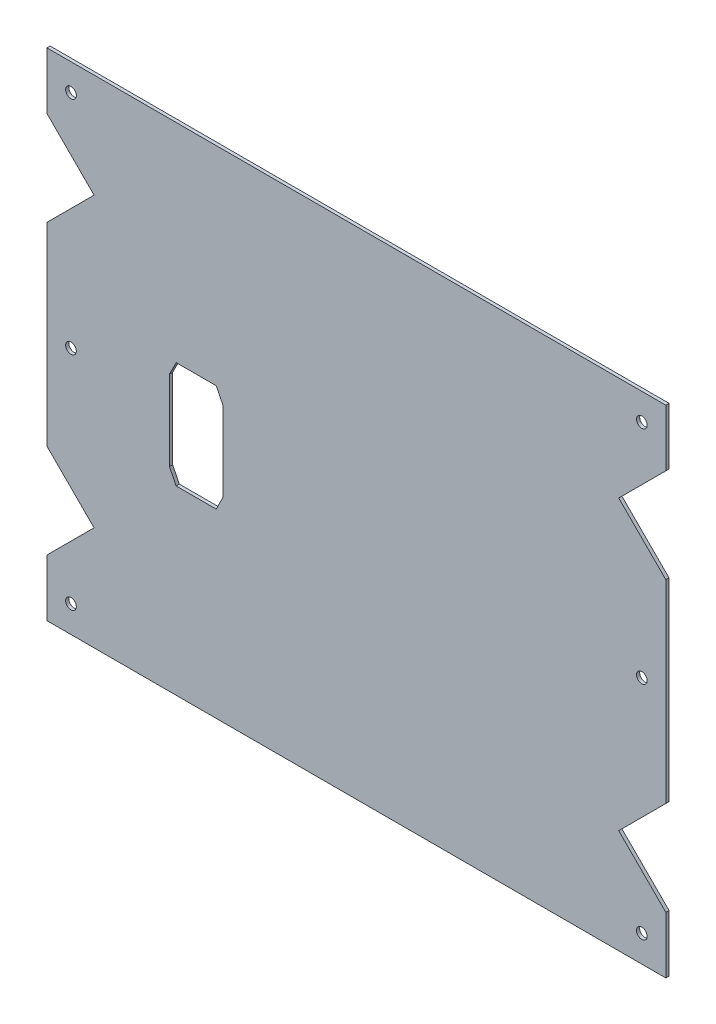
ISO-10303-21;
HEADER;
FILE_DESCRIPTION(('STEP AP214'),'2;1');
FILE_NAME('part.step','',(''),(''),'','','');
FILE_SCHEMA(('AUTOMOTIVE_DESIGN { 1 0 10303 214 1 1 1 1 }'));
ENDSEC;
DATA;
#1=APPLICATION_CONTEXT('core data for automotive mechanical design processes');
#2=APPLICATION_PROTOCOL_DEFINITION('international standard','automotive_design',2000,#1);
#3=PRODUCT_CONTEXT('',#1,'mechanical');
#4=PRODUCT('Part','Part','',(#3));
#5=PRODUCT_RELATED_PRODUCT_CATEGORY('part','',(#4));
#6=PRODUCT_DEFINITION_FORMATION('','',#4);
#7=PRODUCT_DEFINITION_CONTEXT('part definition',#1,'design');
#8=PRODUCT_DEFINITION('design','',#6,#7);
#9=PRODUCT_DEFINITION_SHAPE('','',#8);
#10=(LENGTH_UNIT() NAMED_UNIT(*) SI_UNIT(.MILLI.,.METRE.));
#11=(NAMED_UNIT(*) PLANE_ANGLE_UNIT() SI_UNIT($,.RADIAN.));
#12=(NAMED_UNIT(*) SI_UNIT($,.STERADIAN.) SOLID_ANGLE_UNIT());
#13=UNCERTAINTY_MEASURE_WITH_UNIT(LENGTH_MEASURE(1.E-05),#10,'distance_accuracy_value','');
#14=(GEOMETRIC_REPRESENTATION_CONTEXT(3) GLOBAL_UNCERTAINTY_ASSIGNED_CONTEXT((#13)) GLOBAL_UNIT_ASSIGNED_CONTEXT((#10,
#11,#12)) REPRESENTATION_CONTEXT('',''));
#15=CARTESIAN_POINT('',(0.,0.,0.));
#16=DIRECTION('',(0.,0.,1.));
#17=DIRECTION('',(1.,0.,0.));
#18=AXIS2_PLACEMENT_3D('',#15,#16,#17);
#19=CARTESIAN_POINT('',(0.,0.,-1.2));
#20=DIRECTION('',(0.,0.,-1.));
#21=DIRECTION('',(-1.,0.,0.));
#22=AXIS2_PLACEMENT_3D('',#19,#20,#21);
#23=PLANE('',#22);
#24=DIRECTION('',(0.707106781186547,0.707106781186548,0.));
#25=VECTOR('',#24,1.);
#26=CARTESIAN_POINT('',(-52.5334809732131,54.6464466094065,-1.19999999999963));
#27=LINE('',#26,#25);
#28=CARTESIAN_POINT('',(-15.8870343638064,91.2928932188133,-1.19999999999988));
#29=VERTEX_POINT('',#28);
#30=CARTESIAN_POINT('',(1.76358959928331,108.943517181903,-1.2));
#31=VERTEX_POINT('',#30);
#32=EDGE_CURVE('E857',#29,#31,#27,.T.);
#33=ORIENTED_EDGE('',*,*,#32,.T.);
#34=DIRECTION('',(-0.707106781186546,0.70710678118655,0.));
#35=VECTOR('',#34,1.);
#36=CARTESIAN_POINT('',(-52.5334809732127,163.240587754399,-1.1999999999994));
#37=LINE('',#36,#35);
#38=CARTESIAN_POINT('',(-15.8870343638065,126.594141144993,-1.1999999999998));
#39=VERTEX_POINT('',#38);
#40=EDGE_CURVE('E741',#31,#39,#37,.T.);
#41=ORIENTED_EDGE('',*,*,#40,.T.);
#42=DIRECTION('',(0.,1.,0.));
#43=VECTOR('',#42,1.);
#44=CARTESIAN_POINT('',(-15.8870343638065,109.823634363806,-1.19999999999983));
#45=LINE('',#44,#43);
#46=CARTESIAN_POINT('',(-15.8870343638064,147.887034363806,-1.1999999999997));
#47=VERTEX_POINT('',#46);
#48=EDGE_CURVE('E758',#47,#39,#45,.F.);
#49=ORIENTED_EDGE('',*,*,#48,.F.);
#50=DIRECTION('',(1.,0.,0.));
#51=VECTOR('',#50,1.);
#52=CARTESIAN_POINT('',(199.087034363806,147.887034363806,-1.1999999999998));
#53=LINE('',#52,#51);
#54=CARTESIAN_POINT('',(215.887034363806,147.887034363806,-1.19999999999969));
#55=VERTEX_POINT('',#54);
#56=EDGE_CURVE('E770',#55,#47,#53,.F.);
#57=ORIENTED_EDGE('',*,*,#56,.F.);
#58=DIRECTION('',(0.,-1.,0.));
#59=VECTOR('',#58,1.);
#60=CARTESIAN_POINT('',(215.887034363806,147.887034363806,-1.19999999999969));
#61=LINE('',#60,#59);
#62=CARTESIAN_POINT('',(215.887034363806,126.594141144993,-1.19999999999976));
#63=VERTEX_POINT('',#62);
#64=EDGE_CURVE('E768',#63,#55,#61,.F.);
#65=ORIENTED_EDGE('',*,*,#64,.F.);
#66=DIRECTION('',(-0.707106781186544,-0.707106781186551,0.));
#67=VECTOR('',#66,1.);
#68=CARTESIAN_POINT('',(252.533480973212,163.240587754399,-1.19999999999938));
#69=LINE('',#68,#67);
#70=CARTESIAN_POINT('',(198.236410400717,108.943517181903,-1.19999999999993));
#71=VERTEX_POINT('',#70);
#72=EDGE_CURVE('E747',#63,#71,#69,.T.);
#73=ORIENTED_EDGE('',*,*,#72,.T.);
#74=DIRECTION('',(0.707106781186547,-0.707106781186548,0.));
#75=VECTOR('',#74,1.);
#76=CARTESIAN_POINT('',(252.533480973213,54.6464466094069,-1.19999999999962));
#77=LINE('',#76,#75);
#78=CARTESIAN_POINT('',(215.887034363806,91.2928932188134,-1.1999999999999));
#79=VERTEX_POINT('',#78);
#80=EDGE_CURVE('E723',#71,#79,#77,.T.);
#81=ORIENTED_EDGE('',*,*,#80,.T.);
#82=DIRECTION('',(0.,-1.,0.));
#83=VECTOR('',#82,1.);
#84=CARTESIAN_POINT('',(215.887034363806,108.0634,-1.19999999999992));
#85=LINE('',#84,#83);
#86=CARTESIAN_POINT('',(215.887034363806,18.7071067811867,-1.19999999999987));
#87=VERTEX_POINT('',#86);
#88=EDGE_CURVE('E779',#87,#79,#85,.F.);
#89=ORIENTED_EDGE('',*,*,#88,.F.);
#90=DIRECTION('',(-0.707106781186546,-0.707106781186549,0.));
#91=VECTOR('',#90,1.);
#92=CARTESIAN_POINT('',(197.533480973213,0.353553390593003,-1.19999999999998));
#93=LINE('',#92,#91);
#94=CARTESIAN_POINT('',(198.236410400717,1.05648281809686,-1.19999999999998));
#95=VERTEX_POINT('',#94);
#96=EDGE_CURVE('E718',#87,#95,#93,.T.);
#97=ORIENTED_EDGE('',*,*,#96,.T.);
#98=DIRECTION('',(0.707106781186546,-0.707106781186549,0.));
#99=VECTOR('',#98,1.);
#100=CARTESIAN_POINT('',(197.533480973213,1.75941224560072,-1.20000000000003));
#101=LINE('',#100,#99);
#102=CARTESIAN_POINT('',(215.887034363806,-16.594141144993,-1.1999999999998));
#103=VERTEX_POINT('',#102);
#104=EDGE_CURVE('E792',#95,#103,#101,.T.);
#105=ORIENTED_EDGE('',*,*,#104,.T.);
#106=DIRECTION('',(0.,-1.,0.));
#107=VECTOR('',#106,1.);
#108=CARTESIAN_POINT('',(215.887034363806,0.176365636193672,-1.19999999999991));
#109=LINE('',#108,#107);
#110=CARTESIAN_POINT('',(215.887034363806,-37.8870343638063,-1.19999999999964));
#111=VERTEX_POINT('',#110);
#112=EDGE_CURVE('E801',#111,#103,#109,.F.);
#113=ORIENTED_EDGE('',*,*,#112,.F.);
#114=DIRECTION('',(-1.,0.,0.));
#115=VECTOR('',#114,1.);
#116=CARTESIAN_POINT('',(215.887034363806,-37.8870343638063,-1.19999999999964));
#117=LINE('',#116,#115);
#118=CARTESIAN_POINT('',(-15.8870343638064,-37.8870343638064,-1.19999999999967));
#119=VERTEX_POINT('',#118);
#120=EDGE_CURVE('E820',#119,#111,#117,.F.);
#121=ORIENTED_EDGE('',*,*,#120,.F.);
#122=DIRECTION('',(0.,1.,0.));
#123=VECTOR('',#122,1.);
#124=CARTESIAN_POINT('',(-15.8870343638064,-37.8870343638064,-1.19999999999967));
#125=LINE('',#124,#123);
#126=CARTESIAN_POINT('',(-15.8870343638064,-16.594141144993,-1.1999999999998));
#127=VERTEX_POINT('',#126);
#128=EDGE_CURVE('E814',#127,#119,#125,.F.);
#129=ORIENTED_EDGE('',*,*,#128,.F.);
#130=DIRECTION('',(0.707106781186547,0.707106781186548,0.));
#131=VECTOR('',#130,1.);
#132=CARTESIAN_POINT('',(2.4665190267869,1.75941224560033,-1.20000000000004));
#133=LINE('',#132,#131);
#134=CARTESIAN_POINT('',(1.76358959928338,1.0564828180968,-1.20000000000003));
#135=VERTEX_POINT('',#134);
#136=EDGE_CURVE('E787',#127,#135,#133,.T.);
#137=ORIENTED_EDGE('',*,*,#136,.T.);
#138=DIRECTION('',(-0.707106781186546,0.707106781186549,0.));
#139=VECTOR('',#138,1.);
#140=CARTESIAN_POINT('',(2.46651902678689,0.353553390593291,-1.20000000000001));
#141=LINE('',#140,#139);
#142=CARTESIAN_POINT('',(-15.8870343638064,18.7071067811867,-1.19999999999989));
#143=VERTEX_POINT('',#142);
#144=EDGE_CURVE('E859',#135,#143,#141,.T.);
#145=ORIENTED_EDGE('',*,*,#144,.T.);
#146=DIRECTION('',(0.,1.,0.));
#147=VECTOR('',#146,1.);
#148=CARTESIAN_POINT('',(-15.8870343638064,1.9366,-1.19999999999988));
#149=LINE('',#148,#147);
#150=EDGE_CURVE('E826',#29,#143,#149,.F.);
#151=ORIENTED_EDGE('',*,*,#150,.F.);
#152=EDGE_LOOP('',(#33,#41,#49,#57,#65,#73,#81,#89,#97,#105,#113,#121,#129,#137,#145,#151));
#153=FACE_BOUND('',#152,.T.);
#154=DIRECTION('',(0.447213595499958,-0.894427190999916,0.));
#155=VECTOR('',#154,1.);
#156=CARTESIAN_POINT('',(66.,33.,-1.2));
#157=LINE('',#156,#155);
#158=CARTESIAN_POINT('',(47.5,70.,-1.2));
#159=VERTEX_POINT('',#158);
#160=CARTESIAN_POINT('',(50.,65.,-1.2));
#161=VERTEX_POINT('',#160);
#162=EDGE_CURVE('E13',#159,#161,#157,.T.);
#163=ORIENTED_EDGE('',*,*,#162,.F.);
#164=DIRECTION('',(1.,0.,0.));
#165=VECTOR('',#164,1.);
#166=CARTESIAN_POINT('',(0.,70.,-1.2));
#167=LINE('',#166,#165);
#168=CARTESIAN_POINT('',(32.5,70.,-1.2));
#169=VERTEX_POINT('',#168);
#170=EDGE_CURVE('E891',#169,#159,#167,.T.);
#171=ORIENTED_EDGE('',*,*,#170,.F.);
#172=DIRECTION('',(0.447213595499957,0.894427190999917,0.));
#173=VECTOR('',#172,1.);
#174=CARTESIAN_POINT('',(-1.99999999999995,0.999999999999971,-1.2));
#175=LINE('',#174,#173);
#176=CARTESIAN_POINT('',(30.,65.,-1.2));
#177=VERTEX_POINT('',#176);
#178=EDGE_CURVE('E905',#177,#169,#175,.T.);
#179=ORIENTED_EDGE('',*,*,#178,.F.);
#180=DIRECTION('',(0.,1.,0.));
#181=VECTOR('',#180,1.);
#182=CARTESIAN_POINT('',(30.,0.,-1.2));
#183=LINE('',#182,#181);
#184=CARTESIAN_POINT('',(30.,35.,-1.2));
#185=VERTEX_POINT('',#184);
#186=EDGE_CURVE('E907',#185,#177,#183,.T.);
#187=ORIENTED_EDGE('',*,*,#186,.F.);
#188=DIRECTION('',(-0.447213595499958,0.894427190999916,0.));
#189=VECTOR('',#188,1.);
#190=CARTESIAN_POINT('',(38.,19.,-1.2));
#191=LINE('',#190,#189);
#192=CARTESIAN_POINT('',(32.5,30.,-1.2));
#193=VERTEX_POINT('',#192);
#194=EDGE_CURVE('E909',#193,#185,#191,.T.);
#195=ORIENTED_EDGE('',*,*,#194,.F.);
#196=DIRECTION('',(-1.,0.,0.));
#197=VECTOR('',#196,1.);
#198=CARTESIAN_POINT('',(0.,30.,-1.2));
#199=LINE('',#198,#197);
#200=CARTESIAN_POINT('',(47.5,30.,-1.2));
#201=VERTEX_POINT('',#200);
#202=EDGE_CURVE('E911',#201,#193,#199,.T.);
#203=ORIENTED_EDGE('',*,*,#202,.F.);
#204=DIRECTION('',(-0.447213595499958,-0.894427190999916,0.));
#205=VECTOR('',#204,1.);
#206=CARTESIAN_POINT('',(26.,-13.,-1.2));
#207=LINE('',#206,#205);
#208=CARTESIAN_POINT('',(50.,35.,-1.2));
#209=VERTEX_POINT('',#208);
#210=EDGE_CURVE('E913',#209,#201,#207,.T.);
#211=ORIENTED_EDGE('',*,*,#210,.F.);
#212=DIRECTION('',(0.,-1.,0.));
#213=VECTOR('',#212,1.);
#214=CARTESIAN_POINT('',(50.,0.,-1.2));
#215=LINE('',#214,#213);
#216=EDGE_CURVE('E545',#161,#209,#215,.T.);
#217=ORIENTED_EDGE('',*,*,#216,.F.);
#218=EDGE_LOOP('',(#163,#171,#179,#187,#195,#203,#211,#217));
#219=FACE_BOUND('',#218,.T.);
#220=CARTESIAN_POINT('',(-6.8870343638064,55.,-1.19999999999996));
#221=DIRECTION('',(0.,0.,-1.));
#222=DIRECTION('',(-1.,0.,0.));
#223=AXIS2_PLACEMENT_3D('',#220,#221,#222);
#224=CIRCLE('',#223,2.);
#225=CARTESIAN_POINT('',(-8.8870343638064,55.,-1.19999999999995));
#226=VERTEX_POINT('',#225);
#227=EDGE_CURVE('E862',#226,#226,#224,.F.);
#228=ORIENTED_EDGE('',*,*,#227,.T.);
#229=EDGE_LOOP('',(#228));
#230=FACE_BOUND('',#229,.T.);
#231=CARTESIAN_POINT('',(206.887034363806,55.,-1.19999999999992));
#232=DIRECTION('',(0.,0.,-1.));
#233=DIRECTION('',(-1.,0.,0.));
#234=AXIS2_PLACEMENT_3D('',#231,#232,#233);
#235=CIRCLE('',#234,2.);
#236=CARTESIAN_POINT('',(204.887034363806,55.,-1.19999999999994));
#237=VERTEX_POINT('',#236);
#238=EDGE_CURVE('E834',#237,#237,#235,.F.);
#239=ORIENTED_EDGE('',*,*,#238,.T.);
#240=EDGE_LOOP('',(#239));
#241=FACE_BOUND('',#240,.T.);
#242=CARTESIAN_POINT('',(-6.88703436380642,-27.8870343638064,-1.19999999999978));
#243=DIRECTION('',(0.,0.,-1.));
#244=DIRECTION('',(-1.,0.,0.));
#245=AXIS2_PLACEMENT_3D('',#242,#243,#244);
#246=CIRCLE('',#245,2.);
#247=CARTESIAN_POINT('',(-8.88703436380643,-27.8870343638064,-1.19999999999977));
#248=VERTEX_POINT('',#247);
#249=EDGE_CURVE('E789',#248,#248,#246,.F.);
#250=ORIENTED_EDGE('',*,*,#249,.T.);
#251=EDGE_LOOP('',(#250));
#252=FACE_BOUND('',#251,.T.);
#253=CARTESIAN_POINT('',(206.887034363806,-27.8870343638064,-1.19999999999976));
#254=DIRECTION('',(0.,0.,-1.));
#255=DIRECTION('',(-1.,0.,0.));
#256=AXIS2_PLACEMENT_3D('',#253,#254,#255);
#257=CIRCLE('',#256,2.);
#258=CARTESIAN_POINT('',(204.887034363806,-27.8870343638064,-1.19999999999977));
#259=VERTEX_POINT('',#258);
#260=EDGE_CURVE('E795',#259,#259,#257,.F.);
#261=ORIENTED_EDGE('',*,*,#260,.T.);
#262=EDGE_LOOP('',(#261));
#263=FACE_BOUND('',#262,.T.);
#264=CARTESIAN_POINT('',(-6.88703436380644,137.887034363806,-1.1999999999998));
#265=DIRECTION('',(0.,0.,-1.));
#266=DIRECTION('',(1.,0.,0.));
#267=AXIS2_PLACEMENT_3D('',#264,#265,#266);
#268=CIRCLE('',#267,2.);
#269=CARTESIAN_POINT('',(-4.88703436380644,137.887034363806,-1.19999999999981));
#270=VERTEX_POINT('',#269);
#271=EDGE_CURVE('E744',#270,#270,#268,.F.);
#272=ORIENTED_EDGE('',*,*,#271,.T.);
#273=EDGE_LOOP('',(#272));
#274=FACE_BOUND('',#273,.T.);
#275=CARTESIAN_POINT('',(206.887034363806,137.887034363806,-1.19999999999977));
#276=DIRECTION('',(0.,0.,-1.));
#277=DIRECTION('',(1.,0.,0.));
#278=AXIS2_PLACEMENT_3D('',#275,#276,#277);
#279=CIRCLE('',#278,2.);
#280=CARTESIAN_POINT('',(208.887034363806,137.887034363806,-1.19999999999976));
#281=VERTEX_POINT('',#280);
#282=EDGE_CURVE('E749',#281,#281,#279,.F.);
#283=ORIENTED_EDGE('',*,*,#282,.T.);
#284=EDGE_LOOP('',(#283));
#285=FACE_BOUND('',#284,.T.);
#286=ADVANCED_FACE('F537',(#153,#219,#230,#241,#252,#263,#274,#285),#23,.T.);
#287=CARTESIAN_POINT('',(0.,0.,0.));
#288=DIRECTION('',(0.,0.,-1.));
#289=DIRECTION('',(-1.,0.,0.));
#290=AXIS2_PLACEMENT_3D('',#287,#288,#289);
#291=PLANE('',#290);
#292=DIRECTION('',(-0.707106781186546,0.707106781186549,0.));
#293=VECTOR('',#292,1.);
#294=CARTESIAN_POINT('',(0.17636563619354,110.530741144993,0.));
#295=LINE('',#294,#293);
#296=CARTESIAN_POINT('',(1.76358959928332,108.943517181903,0.));
#297=VERTEX_POINT('',#296);
#298=CARTESIAN_POINT('',(-15.8870343638065,126.594141144993,2.35922392732846E-13));
#299=VERTEX_POINT('',#298);
#300=EDGE_CURVE('E707',#297,#299,#295,.T.);
#301=ORIENTED_EDGE('',*,*,#300,.F.);
#302=DIRECTION('',(0.707106781186546,0.707106781186548,0.));
#303=VECTOR('',#302,1.);
#304=CARTESIAN_POINT('',(-74.7375802551338,32.4423473274858,5.21924329852681E-13));
#305=LINE('',#304,#303);
#306=CARTESIAN_POINT('',(-15.8870343638064,91.2928932188133,1.19553118186656E-13));
#307=VERTEX_POINT('',#306);
#308=EDGE_CURVE('E842',#307,#297,#305,.T.);
#309=ORIENTED_EDGE('',*,*,#308,.F.);
#310=DIRECTION('',(0.,-1.,0.));
#311=VECTOR('',#310,1.);
#312=CARTESIAN_POINT('',(-15.8870343638064,0.,1.15718668211486E-13));
#313=LINE('',#312,#311);
#314=CARTESIAN_POINT('',(-15.8870343638064,18.7071067811867,1.17761411463904E-13));
#315=VERTEX_POINT('',#314);
#316=EDGE_CURVE('E847',#307,#315,#313,.T.);
#317=ORIENTED_EDGE('',*,*,#316,.T.);
#318=DIRECTION('',(-0.707106781186546,0.707106781186549,0.));
#319=VECTOR('',#318,1.);
#320=CARTESIAN_POINT('',(0.176365636193621,2.64370678118658,0.));
#321=LINE('',#320,#319);
#322=CARTESIAN_POINT('',(1.76358959928339,1.05648281809681,0.));
#323=VERTEX_POINT('',#322);
#324=EDGE_CURVE('E855',#323,#315,#321,.T.);
#325=ORIENTED_EDGE('',*,*,#324,.F.);
#326=DIRECTION('',(0.707106781186547,0.707106781186548,0.));
#327=VECTOR('',#326,1.);
#328=CARTESIAN_POINT('',(-28.5896339345667,-29.2967407157534,3.65095383553467E-13));
#329=LINE('',#328,#327);
#330=CARTESIAN_POINT('',(-15.8870343638064,-16.594141144993,2.00337746816147E-13));
#331=VERTEX_POINT('',#330);
#332=EDGE_CURVE('E782',#331,#323,#329,.T.);
#333=ORIENTED_EDGE('',*,*,#332,.F.);
#334=DIRECTION('',(0.,-1.,0.));
#335=VECTOR('',#334,1.);
#336=CARTESIAN_POINT('',(-15.8870343638064,2.11296563619366,0.));
#337=LINE('',#336,#335);
#338=CARTESIAN_POINT('',(-15.8870343638064,-37.8870343638064,3.30660194840709E-13));
#339=VERTEX_POINT('',#338);
#340=EDGE_CURVE('E809',#331,#339,#337,.T.);
#341=ORIENTED_EDGE('',*,*,#340,.T.);
#342=DIRECTION('',(1.,0.,0.));
#343=VECTOR('',#342,1.);
#344=CARTESIAN_POINT('',(2.11296563619357,-37.8870343638064,2.07616288187936E-13));
#345=LINE('',#344,#343);
#346=CARTESIAN_POINT('',(215.887034363806,-37.8870343638063,3.68760480071351E-13));
#347=VERTEX_POINT('',#346);
#348=EDGE_CURVE('E807',#339,#347,#345,.T.);
#349=ORIENTED_EDGE('',*,*,#348,.T.);
#350=DIRECTION('',(0.,1.,0.));
#351=VECTOR('',#350,1.);
#352=CARTESIAN_POINT('',(215.887034363806,2.11296563619367,0.));
#353=LINE('',#352,#351);
#354=CARTESIAN_POINT('',(215.887034363806,-16.5941411449929,2.11150013900997E-13));
#355=VERTEX_POINT('',#354);
#356=EDGE_CURVE('E798',#347,#355,#353,.T.);
#357=ORIENTED_EDGE('',*,*,#356,.T.);
#358=DIRECTION('',(0.707106781186546,-0.707106781186549,0.));
#359=VECTOR('',#358,1.);
#360=CARTESIAN_POINT('',(199.823634363806,-0.530741144992905,0.));
#361=LINE('',#360,#359);
#362=CARTESIAN_POINT('',(198.236410400717,1.05648281809686,0.));
#363=VERTEX_POINT('',#362);
#364=EDGE_CURVE('E780',#363,#355,#361,.T.);
#365=ORIENTED_EDGE('',*,*,#364,.F.);
#366=DIRECTION('',(-0.707106781186546,-0.707106781186549,0.));
#367=VECTOR('',#366,1.);
#368=CARTESIAN_POINT('',(274.737580255134,77.5576526725142,5.55111512312578E-13));
#369=LINE('',#368,#367);
#370=CARTESIAN_POINT('',(215.887034363806,18.7071067811867,1.38777878078145E-13));
#371=VERTEX_POINT('',#370);
#372=EDGE_CURVE('E824',#371,#363,#369,.T.);
#373=ORIENTED_EDGE('',*,*,#372,.F.);
#374=DIRECTION('',(0.,1.,0.));
#375=VECTOR('',#374,1.);
#376=CARTESIAN_POINT('',(215.887034363806,0.,1.38777878078145E-13));
#377=LINE('',#376,#375);
#378=CARTESIAN_POINT('',(215.887034363806,91.2928932188134,1.11022302462516E-13));
#379=VERTEX_POINT('',#378);
#380=EDGE_CURVE('E714',#371,#379,#377,.T.);
#381=ORIENTED_EDGE('',*,*,#380,.T.);
#382=DIRECTION('',(0.707106781186547,-0.707106781186548,0.));
#383=VECTOR('',#382,1.);
#384=CARTESIAN_POINT('',(199.823634363806,107.356293218813,0.));
#385=LINE('',#384,#383);
#386=CARTESIAN_POINT('',(198.236410400717,108.943517181903,0.));
#387=VERTEX_POINT('',#386);
#388=EDGE_CURVE('E710',#387,#379,#385,.T.);
#389=ORIENTED_EDGE('',*,*,#388,.F.);
#390=DIRECTION('',(-0.707106781186544,-0.707106781186551,0.));
#391=VECTOR('',#390,1.);
#392=CARTESIAN_POINT('',(228.589633934567,139.296740715753,4.02455846426619E-13));
#393=LINE('',#392,#391);
#394=CARTESIAN_POINT('',(215.887034363806,126.594141144993,2.4980018054066E-13));
#395=VERTEX_POINT('',#394);
#396=EDGE_CURVE('E698',#395,#387,#393,.T.);
#397=ORIENTED_EDGE('',*,*,#396,.F.);
#398=DIRECTION('',(0.,1.,0.));
#399=VECTOR('',#398,1.);
#400=CARTESIAN_POINT('',(215.887034363806,107.887034363806,1.80411241501588E-13));
#401=LINE('',#400,#399);
#402=CARTESIAN_POINT('',(215.887034363806,147.887034363806,3.19189119579733E-13));
#403=VERTEX_POINT('',#402);
#404=EDGE_CURVE('E766',#395,#403,#401,.T.);
#405=ORIENTED_EDGE('',*,*,#404,.T.);
#406=DIRECTION('',(-1.,0.,0.));
#407=VECTOR('',#406,1.);
#408=CARTESIAN_POINT('',(307.887034363806,147.887034363807,9.57567358739198E-13));
#409=LINE('',#408,#407);
#410=CARTESIAN_POINT('',(-15.8870343638064,147.887034363806,3.05311331771918E-13));
#411=VERTEX_POINT('',#410);
#412=EDGE_CURVE('E764',#403,#411,#409,.T.);
#413=ORIENTED_EDGE('',*,*,#412,.T.);
#414=DIRECTION('',(0.,-1.,0.));
#415=VECTOR('',#414,1.);
#416=CARTESIAN_POINT('',(-15.8870343638065,107.887034363806,1.80411241501588E-13));
#417=LINE('',#416,#415);
#418=EDGE_CURVE('E752',#411,#299,#417,.T.);
#419=ORIENTED_EDGE('',*,*,#418,.T.);
#420=EDGE_LOOP('',(#301,#309,#317,#325,#333,#341,#349,#357,#365,#373,#381,#389,#397,#405,#413,#419));
#421=FACE_BOUND('',#420,.T.);
#422=DIRECTION('',(-1.,0.,0.));
#423=VECTOR('',#422,1.);
#424=CARTESIAN_POINT('',(32.5,70.,0.));
#425=LINE('',#424,#423);
#426=CARTESIAN_POINT('',(47.5,70.,0.));
#427=VERTEX_POINT('',#426);
#428=CARTESIAN_POINT('',(32.5,70.,0.));
#429=VERTEX_POINT('',#428);
#430=EDGE_CURVE('E868',#427,#429,#425,.T.);
#431=ORIENTED_EDGE('',*,*,#430,.F.);
#432=DIRECTION('',(-0.447213595499958,0.894427190999916,0.));
#433=VECTOR('',#432,1.);
#434=CARTESIAN_POINT('',(47.5,70.,0.));
#435=LINE('',#434,#433);
#436=CARTESIAN_POINT('',(50.,65.,0.));
#437=VERTEX_POINT('',#436);
#438=EDGE_CURVE('E560',#437,#427,#435,.T.);
#439=ORIENTED_EDGE('',*,*,#438,.F.);
#440=DIRECTION('',(0.,1.,0.));
#441=VECTOR('',#440,1.);
#442=CARTESIAN_POINT('',(50.,65.,0.));
#443=LINE('',#442,#441);
#444=CARTESIAN_POINT('',(50.,35.,0.));
#445=VERTEX_POINT('',#444);
#446=EDGE_CURVE('E885',#445,#437,#443,.T.);
#447=ORIENTED_EDGE('',*,*,#446,.F.);
#448=DIRECTION('',(0.447213595499958,0.894427190999916,0.));
#449=VECTOR('',#448,1.);
#450=CARTESIAN_POINT('',(47.5,30.,0.));
#451=LINE('',#450,#449);
#452=CARTESIAN_POINT('',(47.5,30.,0.));
#453=VERTEX_POINT('',#452);
#454=EDGE_CURVE('E882',#453,#445,#451,.T.);
#455=ORIENTED_EDGE('',*,*,#454,.F.);
#456=DIRECTION('',(1.,0.,0.));
#457=VECTOR('',#456,1.);
#458=CARTESIAN_POINT('',(32.5,30.,0.));
#459=LINE('',#458,#457);
#460=CARTESIAN_POINT('',(32.5,30.,0.));
#461=VERTEX_POINT('',#460);
#462=EDGE_CURVE('E879',#461,#453,#459,.T.);
#463=ORIENTED_EDGE('',*,*,#462,.F.);
#464=DIRECTION('',(0.447213595499958,-0.894427190999916,0.));
#465=VECTOR('',#464,1.);
#466=CARTESIAN_POINT('',(30.,35.,0.));
#467=LINE('',#466,#465);
#468=CARTESIAN_POINT('',(30.,35.,0.));
#469=VERTEX_POINT('',#468);
#470=EDGE_CURVE('E876',#469,#461,#467,.T.);
#471=ORIENTED_EDGE('',*,*,#470,.F.);
#472=DIRECTION('',(0.,-1.,0.));
#473=VECTOR('',#472,1.);
#474=CARTESIAN_POINT('',(30.,65.,0.));
#475=LINE('',#474,#473);
#476=CARTESIAN_POINT('',(30.,65.,0.));
#477=VERTEX_POINT('',#476);
#478=EDGE_CURVE('E873',#477,#469,#475,.T.);
#479=ORIENTED_EDGE('',*,*,#478,.F.);
#480=DIRECTION('',(-0.447213595499957,-0.894427190999916,0.));
#481=VECTOR('',#480,1.);
#482=CARTESIAN_POINT('',(30.,65.,0.));
#483=LINE('',#482,#481);
#484=EDGE_CURVE('E870',#429,#477,#483,.T.);
#485=ORIENTED_EDGE('',*,*,#484,.F.);
#486=EDGE_LOOP('',(#431,#439,#447,#455,#463,#471,#479,#485));
#487=FACE_BOUND('',#486,.T.);
#488=CARTESIAN_POINT('',(-6.88703436380639,55.,0.));
#489=DIRECTION('',(0.,0.,-1.));
#490=DIRECTION('',(-1.,0.,0.));
#491=AXIS2_PLACEMENT_3D('',#488,#489,#490);
#492=CIRCLE('',#491,2.);
#493=CARTESIAN_POINT('',(-8.88703436380639,55.,0.));
#494=VERTEX_POINT('',#493);
#495=EDGE_CURVE('E850',#494,#494,#492,.T.);
#496=ORIENTED_EDGE('',*,*,#495,.T.);
#497=EDGE_LOOP('',(#496));
#498=FACE_BOUND('',#497,.T.);
#499=CARTESIAN_POINT('',(206.887034363806,55.,1.11022302462516E-13));
#500=DIRECTION('',(0.,0.,1.));
#501=DIRECTION('',(1.,0.,0.));
#502=AXIS2_PLACEMENT_3D('',#499,#500,#501);
#503=CIRCLE('',#502,2.);
#504=CARTESIAN_POINT('',(208.887034363806,55.,1.18005265140202E-13));
#505=VERTEX_POINT('',#504);
#506=EDGE_CURVE('E837',#505,#505,#503,.T.);
#507=ORIENTED_EDGE('',*,*,#506,.F.);
#508=EDGE_LOOP('',(#507));
#509=FACE_BOUND('',#508,.T.);
#510=CARTESIAN_POINT('',(206.887034363806,-27.8870343638064,2.77009804678872E-13));
#511=DIRECTION('',(0.,0.,1.));
#512=DIRECTION('',(0.,1.,0.));
#513=AXIS2_PLACEMENT_3D('',#510,#511,#512);
#514=CIRCLE('',#513,2.);
#515=CARTESIAN_POINT('',(206.887034363806,-25.8870343638064,2.62667337707909E-13));
#516=VERTEX_POINT('',#515);
#517=EDGE_CURVE('E738',#516,#516,#514,.T.);
#518=ORIENTED_EDGE('',*,*,#517,.F.);
#519=EDGE_LOOP('',(#518));
#520=FACE_BOUND('',#519,.T.);
#521=CARTESIAN_POINT('',(-6.88703436380642,-27.8870343638064,1.39688347944654E-13));
#522=DIRECTION('',(0.,0.,-1.));
#523=DIRECTION('',(0.,1.,0.));
#524=AXIS2_PLACEMENT_3D('',#521,#522,#523);
#525=CIRCLE('',#524,2.);
#526=CARTESIAN_POINT('',(-6.88703436380641,-25.8870343638064,1.30350343893119E-13));
#527=VERTEX_POINT('',#526);
#528=EDGE_CURVE('E811',#527,#527,#525,.T.);
#529=ORIENTED_EDGE('',*,*,#528,.T.);
#530=EDGE_LOOP('',(#529));
#531=FACE_BOUND('',#530,.T.);
#532=CARTESIAN_POINT('',(-6.88703436380644,137.887034363806,0.));
#533=DIRECTION('',(0.,0.,-1.));
#534=DIRECTION('',(0.,1.,0.));
#535=AXIS2_PLACEMENT_3D('',#532,#533,#534);
#536=CIRCLE('',#535,2.);
#537=CARTESIAN_POINT('',(-6.88703436380645,139.887034363806,0.));
#538=VERTEX_POINT('',#537);
#539=EDGE_CURVE('E755',#538,#538,#536,.T.);
#540=ORIENTED_EDGE('',*,*,#539,.T.);
#541=EDGE_LOOP('',(#540));
#542=FACE_BOUND('',#541,.T.);
#543=CARTESIAN_POINT('',(206.887034363806,137.887034363806,2.91433543964104E-13));
#544=DIRECTION('',(0.,0.,1.));
#545=DIRECTION('',(0.,1.,0.));
#546=AXIS2_PLACEMENT_3D('',#543,#544,#545);
#547=CIRCLE('',#546,2.);
#548=CARTESIAN_POINT('',(206.887034363806,139.887034363806,2.9841650664179E-13));
#549=VERTEX_POINT('',#548);
#550=EDGE_CURVE('E735',#549,#549,#547,.T.);
#551=ORIENTED_EDGE('',*,*,#550,.F.);
#552=EDGE_LOOP('',(#551));
#553=FACE_BOUND('',#552,.T.);
#554=ADVANCED_FACE('F539',(#421,#487,#498,#509,#520,#531,#542,#553),#291,.F.);
#555=CARTESIAN_POINT('',(47.5,70.,-40.0000000000001));
#556=DIRECTION('',(0.894427190999916,0.447213595499958,0.));
#557=DIRECTION('',(-0.447213595499958,0.894427190999916,0.));
#558=AXIS2_PLACEMENT_3D('',#555,#556,#557);
#559=PLANE('',#558);
#560=ORIENTED_EDGE('',*,*,#162,.T.);
#561=DIRECTION('',(0.,0.,1.));
#562=VECTOR('',#561,1.);
#563=CARTESIAN_POINT('',(50.,65.,-40.0000000000001));
#564=LINE('',#563,#562);
#565=EDGE_CURVE('E889',#161,#437,#564,.T.);
#566=ORIENTED_EDGE('',*,*,#565,.T.);
#567=ORIENTED_EDGE('',*,*,#438,.T.);
#568=DIRECTION('',(0.,0.,1.));
#569=VECTOR('',#568,1.);
#570=CARTESIAN_POINT('',(47.5,70.,-40.0000000000001));
#571=LINE('',#570,#569);
#572=EDGE_CURVE('E888',#159,#427,#571,.T.);
#573=ORIENTED_EDGE('',*,*,#572,.F.);
#574=EDGE_LOOP('',(#560,#566,#567,#573));
#575=FACE_BOUND('',#574,.T.);
#576=ADVANCED_FACE('F945',(#575),#559,.F.);
#577=CARTESIAN_POINT('',(50.,65.,-40.0000000000001));
#578=DIRECTION('',(1.,0.,0.));
#579=DIRECTION('',(0.,1.,0.));
#580=AXIS2_PLACEMENT_3D('',#577,#578,#579);
#581=PLANE('',#580);
#582=ORIENTED_EDGE('',*,*,#216,.T.);
#583=DIRECTION('',(0.,0.,1.));
#584=VECTOR('',#583,1.);
#585=CARTESIAN_POINT('',(50.,35.,-40.0000000000001));
#586=LINE('',#585,#584);
#587=EDGE_CURVE('E892',#209,#445,#586,.T.);
#588=ORIENTED_EDGE('',*,*,#587,.T.);
#589=ORIENTED_EDGE('',*,*,#446,.T.);
#590=ORIENTED_EDGE('',*,*,#565,.F.);
#591=EDGE_LOOP('',(#582,#588,#589,#590));
#592=FACE_BOUND('',#591,.T.);
#593=ADVANCED_FACE('F918',(#592),#581,.F.);
#594=CARTESIAN_POINT('',(47.5,30.,-40.0000000000001));
#595=DIRECTION('',(0.894427190999916,-0.447213595499958,0.));
#596=DIRECTION('',(0.447213595499958,0.894427190999916,0.));
#597=AXIS2_PLACEMENT_3D('',#594,#595,#596);
#598=PLANE('',#597);
#599=ORIENTED_EDGE('',*,*,#210,.T.);
#600=DIRECTION('',(0.,0.,1.));
#601=VECTOR('',#600,1.);
#602=CARTESIAN_POINT('',(47.5,30.,-40.0000000000001));
#603=LINE('',#602,#601);
#604=EDGE_CURVE('E894',#201,#453,#603,.T.);
#605=ORIENTED_EDGE('',*,*,#604,.T.);
#606=ORIENTED_EDGE('',*,*,#454,.T.);
#607=ORIENTED_EDGE('',*,*,#587,.F.);
#608=EDGE_LOOP('',(#599,#605,#606,#607));
#609=FACE_BOUND('',#608,.T.);
#610=ADVANCED_FACE('F923',(#609),#598,.F.);
#611=CARTESIAN_POINT('',(32.5,30.,-40.0000000000001));
#612=DIRECTION('',(0.,-1.,0.));
#613=DIRECTION('',(0.,0.,-1.));
#614=AXIS2_PLACEMENT_3D('',#611,#612,#613);
#615=PLANE('',#614);
#616=ORIENTED_EDGE('',*,*,#202,.T.);
#617=DIRECTION('',(0.,0.,1.));
#618=VECTOR('',#617,1.);
#619=CARTESIAN_POINT('',(32.5,30.,-40.0000000000001));
#620=LINE('',#619,#618);
#621=EDGE_CURVE('E896',#193,#461,#620,.T.);
#622=ORIENTED_EDGE('',*,*,#621,.T.);
#623=ORIENTED_EDGE('',*,*,#462,.T.);
#624=ORIENTED_EDGE('',*,*,#604,.F.);
#625=EDGE_LOOP('',(#616,#622,#623,#624));
#626=FACE_BOUND('',#625,.T.);
#627=ADVANCED_FACE('F933',(#626),#615,.F.);
#628=CARTESIAN_POINT('',(30.,35.,-40.0000000000001));
#629=DIRECTION('',(-0.894427190999916,-0.447213595499958,0.));
#630=DIRECTION('',(0.447213595499958,-0.894427190999916,0.));
#631=AXIS2_PLACEMENT_3D('',#628,#629,#630);
#632=PLANE('',#631);
#633=ORIENTED_EDGE('',*,*,#194,.T.);
#634=DIRECTION('',(0.,0.,1.));
#635=VECTOR('',#634,1.);
#636=CARTESIAN_POINT('',(30.,35.,-40.0000000000001));
#637=LINE('',#636,#635);
#638=EDGE_CURVE('E898',#185,#469,#637,.T.);
#639=ORIENTED_EDGE('',*,*,#638,.T.);
#640=ORIENTED_EDGE('',*,*,#470,.T.);
#641=ORIENTED_EDGE('',*,*,#621,.F.);
#642=EDGE_LOOP('',(#633,#639,#640,#641));
#643=FACE_BOUND('',#642,.T.);
#644=ADVANCED_FACE('F935',(#643),#632,.F.);
#645=CARTESIAN_POINT('',(30.,65.,-40.0000000000001));
#646=DIRECTION('',(-1.,0.,0.));
#647=DIRECTION('',(0.,-1.,0.));
#648=AXIS2_PLACEMENT_3D('',#645,#646,#647);
#649=PLANE('',#648);
#650=ORIENTED_EDGE('',*,*,#186,.T.);
#651=DIRECTION('',(0.,0.,1.));
#652=VECTOR('',#651,1.);
#653=CARTESIAN_POINT('',(30.,65.,-40.0000000000001));
#654=LINE('',#653,#652);
#655=EDGE_CURVE('E900',#177,#477,#654,.T.);
#656=ORIENTED_EDGE('',*,*,#655,.T.);
#657=ORIENTED_EDGE('',*,*,#478,.T.);
#658=ORIENTED_EDGE('',*,*,#638,.F.);
#659=EDGE_LOOP('',(#650,#656,#657,#658));
#660=FACE_BOUND('',#659,.T.);
#661=ADVANCED_FACE('F951',(#660),#649,.F.);
#662=CARTESIAN_POINT('',(30.,65.,-40.0000000000001));
#663=DIRECTION('',(-0.894427190999916,0.447213595499957,0.));
#664=DIRECTION('',(-0.447213595499957,-0.894427190999917,0.));
#665=AXIS2_PLACEMENT_3D('',#662,#663,#664);
#666=PLANE('',#665);
#667=ORIENTED_EDGE('',*,*,#178,.T.);
#668=DIRECTION('',(0.,0.,1.));
#669=VECTOR('',#668,1.);
#670=CARTESIAN_POINT('',(32.5,70.,-40.0000000000001));
#671=LINE('',#670,#669);
#672=EDGE_CURVE('E552',#169,#429,#671,.T.);
#673=ORIENTED_EDGE('',*,*,#672,.T.);
#674=ORIENTED_EDGE('',*,*,#484,.T.);
#675=ORIENTED_EDGE('',*,*,#655,.F.);
#676=EDGE_LOOP('',(#667,#673,#674,#675));
#677=FACE_BOUND('',#676,.T.);
#678=ADVANCED_FACE('F949',(#677),#666,.F.);
#679=CARTESIAN_POINT('',(32.5,70.,-40.0000000000001));
#680=DIRECTION('',(0.,1.,0.));
#681=DIRECTION('',(0.,0.,1.));
#682=AXIS2_PLACEMENT_3D('',#679,#680,#681);
#683=PLANE('',#682);
#684=ORIENTED_EDGE('',*,*,#170,.T.);
#685=ORIENTED_EDGE('',*,*,#572,.T.);
#686=ORIENTED_EDGE('',*,*,#430,.T.);
#687=ORIENTED_EDGE('',*,*,#672,.F.);
#688=EDGE_LOOP('',(#684,#685,#686,#687));
#689=FACE_BOUND('',#688,.T.);
#690=ADVANCED_FACE('F943',(#689),#683,.F.);
#691=CARTESIAN_POINT('',(-15.8870343638064,1.9366,1.15687522230679E-13));
#692=DIRECTION('',(1.,0.,0.));
#693=DIRECTION('',(0.,0.,-1.));
#694=AXIS2_PLACEMENT_3D('',#691,#692,#693);
#695=PLANE('',#694);
#696=DIRECTION('',(0.,0.,-1.));
#697=VECTOR('',#696,1.);
#698=CARTESIAN_POINT('',(-15.8870343638064,18.7071067811867,1.16391910787591E-13));
#699=LINE('',#698,#697);
#700=EDGE_CURVE('E853',#315,#143,#699,.T.);
#701=ORIENTED_EDGE('',*,*,#700,.F.);
#702=ORIENTED_EDGE('',*,*,#316,.F.);
#703=DIRECTION('',(0.,0.,1.));
#704=VECTOR('',#703,1.);
#705=CARTESIAN_POINT('',(-15.8870343638064,91.2928932188133,1.19440631856561E-13));
#706=LINE('',#705,#704);
#707=EDGE_CURVE('E844',#29,#307,#706,.T.);
#708=ORIENTED_EDGE('',*,*,#707,.F.);
#709=ORIENTED_EDGE('',*,*,#150,.T.);
#710=EDGE_LOOP('',(#701,#702,#708,#709));
#711=FACE_BOUND('',#710,.T.);
#712=ADVANCED_FACE('F969',(#711),#695,.F.);
#713=CARTESIAN_POINT('',(-6.88703436380709,55.,-200.));
#714=DIRECTION('',(0.,0.,1.));
#715=DIRECTION('',(1.,0.,0.));
#716=AXIS2_PLACEMENT_3D('',#713,#714,#715);
#717=CYLINDRICAL_SURFACE('',#716,2.);
#718=ORIENTED_EDGE('',*,*,#227,.F.);
#719=EDGE_LOOP('',(#718));
#720=FACE_BOUND('',#719,.T.);
#721=ORIENTED_EDGE('',*,*,#495,.F.);
#722=EDGE_LOOP('',(#721));
#723=FACE_BOUND('',#722,.T.);
#724=ADVANCED_FACE('F973',(#720,#723),#717,.F.);
#725=CARTESIAN_POINT('',(0.176365636193621,2.64370678118658,0.));
#726=DIRECTION('',(-0.707106781186549,-0.707106781186546,0.));
#727=DIRECTION('',(-0.707106781186546,0.707106781186549,0.));
#728=AXIS2_PLACEMENT_3D('',#725,#726,#727);
#729=PLANE('',#728);
#730=ORIENTED_EDGE('',*,*,#144,.F.);
#731=DIRECTION('',(0.,0.,-1.));
#732=VECTOR('',#731,1.);
#733=CARTESIAN_POINT('',(1.76358959928339,1.05648281809681,0.));
#734=LINE('',#733,#732);
#735=EDGE_CURVE('E732',#323,#135,#734,.T.);
#736=ORIENTED_EDGE('',*,*,#735,.F.);
#737=ORIENTED_EDGE('',*,*,#324,.T.);
#738=ORIENTED_EDGE('',*,*,#700,.T.);
#739=EDGE_LOOP('',(#730,#736,#737,#738));
#740=FACE_BOUND('',#739,.T.);
#741=ADVANCED_FACE('F979',(#740),#729,.T.);
#742=CARTESIAN_POINT('',(-74.7375802551338,32.4423473274858,5.21924329852681E-13));
#743=DIRECTION('',(-0.707106781186548,0.707106781186547,0.));
#744=DIRECTION('',(0.707106781186547,0.707106781186548,0.));
#745=AXIS2_PLACEMENT_3D('',#742,#743,#744);
#746=PLANE('',#745);
#747=ORIENTED_EDGE('',*,*,#32,.F.);
#748=ORIENTED_EDGE('',*,*,#707,.T.);
#749=ORIENTED_EDGE('',*,*,#308,.T.);
#750=DIRECTION('',(0.,0.,-1.));
#751=VECTOR('',#750,1.);
#752=CARTESIAN_POINT('',(1.76358959928332,108.943517181903,0.));
#753=LINE('',#752,#751);
#754=EDGE_CURVE('E727',#297,#31,#753,.T.);
#755=ORIENTED_EDGE('',*,*,#754,.T.);
#756=EDGE_LOOP('',(#747,#748,#749,#755));
#757=FACE_BOUND('',#756,.T.);
#758=ADVANCED_FACE('F989',(#757),#746,.T.);
#759=CARTESIAN_POINT('',(215.887034363806,108.0634,0.));
#760=DIRECTION('',(-1.,0.,0.));
#761=DIRECTION('',(0.,0.,1.));
#762=AXIS2_PLACEMENT_3D('',#759,#760,#761);
#763=PLANE('',#762);
#764=DIRECTION('',(0.,0.,-1.));
#765=VECTOR('',#764,1.);
#766=CARTESIAN_POINT('',(215.887034363806,91.2928932188134,1.11022302462516E-13));
#767=LINE('',#766,#765);
#768=EDGE_CURVE('E717',#379,#79,#767,.T.);
#769=ORIENTED_EDGE('',*,*,#768,.F.);
#770=ORIENTED_EDGE('',*,*,#380,.F.);
#771=DIRECTION('',(0.,0.,1.));
#772=VECTOR('',#771,1.);
#773=CARTESIAN_POINT('',(215.887034363806,18.7071067811867,1.11022302462516E-13));
#774=LINE('',#773,#772);
#775=EDGE_CURVE('E827',#87,#371,#774,.T.);
#776=ORIENTED_EDGE('',*,*,#775,.F.);
#777=ORIENTED_EDGE('',*,*,#88,.T.);
#778=EDGE_LOOP('',(#769,#770,#776,#777));
#779=FACE_BOUND('',#778,.T.);
#780=ADVANCED_FACE('F993',(#779),#763,.F.);
#781=CARTESIAN_POINT('',(206.887034363806,55.,1.11022302462516E-13));
#782=DIRECTION('',(0.,0.,-1.));
#783=DIRECTION('',(-1.,0.,0.));
#784=AXIS2_PLACEMENT_3D('',#781,#782,#783);
#785=CYLINDRICAL_SURFACE('',#784,2.);
#786=ORIENTED_EDGE('',*,*,#238,.F.);
#787=EDGE_LOOP('',(#786));
#788=FACE_BOUND('',#787,.T.);
#789=ORIENTED_EDGE('',*,*,#506,.T.);
#790=EDGE_LOOP('',(#789));
#791=FACE_BOUND('',#790,.T.);
#792=ADVANCED_FACE('F1063',(#788,#791),#785,.F.);
#793=CARTESIAN_POINT('',(199.823634363806,107.356293218813,0.));
#794=DIRECTION('',(0.707106781186548,0.707106781186547,0.));
#795=DIRECTION('',(-0.707106781186547,0.707106781186548,0.));
#796=AXIS2_PLACEMENT_3D('',#793,#794,#795);
#797=PLANE('',#796);
#798=ORIENTED_EDGE('',*,*,#80,.F.);
#799=DIRECTION('',(0.,0.,-1.));
#800=VECTOR('',#799,1.);
#801=CARTESIAN_POINT('',(198.236410400717,108.943517181903,0.));
#802=LINE('',#801,#800);
#803=EDGE_CURVE('E703',#387,#71,#802,.T.);
#804=ORIENTED_EDGE('',*,*,#803,.F.);
#805=ORIENTED_EDGE('',*,*,#388,.T.);
#806=ORIENTED_EDGE('',*,*,#768,.T.);
#807=EDGE_LOOP('',(#798,#804,#805,#806));
#808=FACE_BOUND('',#807,.T.);
#809=ADVANCED_FACE('F721',(#808),#797,.T.);
#810=CARTESIAN_POINT('',(274.737580255134,77.5576526725142,5.55111512312578E-13));
#811=DIRECTION('',(0.707106781186549,-0.707106781186546,0.));
#812=DIRECTION('',(0.707106781186546,0.707106781186549,0.));
#813=AXIS2_PLACEMENT_3D('',#810,#811,#812);
#814=PLANE('',#813);
#815=ORIENTED_EDGE('',*,*,#96,.F.);
#816=ORIENTED_EDGE('',*,*,#775,.T.);
#817=ORIENTED_EDGE('',*,*,#372,.T.);
#818=DIRECTION('',(0.,0.,-1.));
#819=VECTOR('',#818,1.);
#820=CARTESIAN_POINT('',(198.236410400717,1.05648281809686,0.));
#821=LINE('',#820,#819);
#822=EDGE_CURVE('E724',#363,#95,#821,.T.);
#823=ORIENTED_EDGE('',*,*,#822,.T.);
#824=EDGE_LOOP('',(#815,#816,#817,#823));
#825=FACE_BOUND('',#824,.T.);
#826=ADVANCED_FACE('F984',(#825),#814,.T.);
#827=CARTESIAN_POINT('',(206.887034363806,-27.8870343638064,2.77009804678872E-13));
#828=DIRECTION('',(0.,0.,-1.));
#829=DIRECTION('',(0.,1.,0.));
#830=AXIS2_PLACEMENT_3D('',#827,#828,#829);
#831=CYLINDRICAL_SURFACE('',#830,2.);
#832=ORIENTED_EDGE('',*,*,#260,.F.);
#833=EDGE_LOOP('',(#832));
#834=FACE_BOUND('',#833,.T.);
#835=ORIENTED_EDGE('',*,*,#517,.T.);
#836=EDGE_LOOP('',(#835));
#837=FACE_BOUND('',#836,.T.);
#838=ADVANCED_FACE('F1092',(#834,#837),#831,.F.);
#839=CARTESIAN_POINT('',(-6.88703436380709,-27.8870343638073,-200.));
#840=DIRECTION('',(0.,0.,1.));
#841=DIRECTION('',(0.,1.,0.));
#842=AXIS2_PLACEMENT_3D('',#839,#840,#841);
#843=CYLINDRICAL_SURFACE('',#842,2.);
#844=ORIENTED_EDGE('',*,*,#249,.F.);
#845=EDGE_LOOP('',(#844));
#846=FACE_BOUND('',#845,.T.);
#847=ORIENTED_EDGE('',*,*,#528,.F.);
#848=EDGE_LOOP('',(#847));
#849=FACE_BOUND('',#848,.T.);
#850=ADVANCED_FACE('F1102',(#846,#849),#843,.F.);
#851=CARTESIAN_POINT('',(215.887034363806,-37.8870343638063,3.68760480071351E-13));
#852=DIRECTION('',(0.,1.,0.));
#853=DIRECTION('',(-1.,0.,0.));
#854=AXIS2_PLACEMENT_3D('',#851,#852,#853);
#855=PLANE('',#854);
#856=DIRECTION('',(0.,0.,-1.));
#857=VECTOR('',#856,1.);
#858=CARTESIAN_POINT('',(215.887034363806,-37.8870343638063,3.68760480071351E-13));
#859=LINE('',#858,#857);
#860=EDGE_CURVE('E804',#347,#111,#859,.T.);
#861=ORIENTED_EDGE('',*,*,#860,.F.);
#862=ORIENTED_EDGE('',*,*,#348,.F.);
#863=DIRECTION('',(0.,0.,-1.));
#864=VECTOR('',#863,1.);
#865=CARTESIAN_POINT('',(-15.8870343638064,-37.8870343638063,3.30645027202948E-13));
#866=LINE('',#865,#864);
#867=EDGE_CURVE('E817',#339,#119,#866,.T.);
#868=ORIENTED_EDGE('',*,*,#867,.T.);
#869=ORIENTED_EDGE('',*,*,#120,.T.);
#870=EDGE_LOOP('',(#861,#862,#868,#869));
#871=FACE_BOUND('',#870,.T.);
#872=ADVANCED_FACE('F1113',(#871),#855,.F.);
#873=CARTESIAN_POINT('',(-15.8870343638064,-37.8870343638063,3.30751898459098E-13));
#874=DIRECTION('',(1.,0.,0.));
#875=DIRECTION('',(0.,0.,-1.));
#876=AXIS2_PLACEMENT_3D('',#873,#874,#875);
#877=PLANE('',#876);
#878=DIRECTION('',(0.,0.,1.));
#879=VECTOR('',#878,1.);
#880=CARTESIAN_POINT('',(-15.8870343638064,-16.594141144993,1.99543346124884E-13));
#881=LINE('',#880,#879);
#882=EDGE_CURVE('E784',#127,#331,#881,.T.);
#883=ORIENTED_EDGE('',*,*,#882,.F.);
#884=ORIENTED_EDGE('',*,*,#128,.T.);
#885=ORIENTED_EDGE('',*,*,#867,.F.);
#886=ORIENTED_EDGE('',*,*,#340,.F.);
#887=EDGE_LOOP('',(#883,#884,#885,#886));
#888=FACE_BOUND('',#887,.T.);
#889=ADVANCED_FACE('F1125',(#888),#877,.F.);
#890=CARTESIAN_POINT('',(215.887034363806,0.176365636193681,0.));
#891=DIRECTION('',(-1.,0.,0.));
#892=DIRECTION('',(0.,0.,1.));
#893=AXIS2_PLACEMENT_3D('',#890,#891,#892);
#894=PLANE('',#893);
#895=DIRECTION('',(0.,0.,-1.));
#896=VECTOR('',#895,1.);
#897=CARTESIAN_POINT('',(215.887034363806,-16.5941411449929,2.11150013900997E-13));
#898=LINE('',#897,#896);
#899=EDGE_CURVE('E777',#355,#103,#898,.T.);
#900=ORIENTED_EDGE('',*,*,#899,.F.);
#901=ORIENTED_EDGE('',*,*,#356,.F.);
#902=ORIENTED_EDGE('',*,*,#860,.T.);
#903=ORIENTED_EDGE('',*,*,#112,.T.);
#904=EDGE_LOOP('',(#900,#901,#902,#903));
#905=FACE_BOUND('',#904,.T.);
#906=ADVANCED_FACE('F1139',(#905),#894,.F.);
#907=CARTESIAN_POINT('',(-28.5896339345667,-29.2967407157534,3.65095383553467E-13));
#908=DIRECTION('',(-0.707106781186548,0.707106781186547,0.));
#909=DIRECTION('',(0.707106781186547,0.707106781186548,0.));
#910=AXIS2_PLACEMENT_3D('',#907,#908,#909);
#911=PLANE('',#910);
#912=ORIENTED_EDGE('',*,*,#136,.F.);
#913=ORIENTED_EDGE('',*,*,#882,.T.);
#914=ORIENTED_EDGE('',*,*,#332,.T.);
#915=ORIENTED_EDGE('',*,*,#735,.T.);
#916=EDGE_LOOP('',(#912,#913,#914,#915));
#917=FACE_BOUND('',#916,.T.);
#918=ADVANCED_FACE('F1150',(#917),#911,.T.);
#919=CARTESIAN_POINT('',(199.823634363806,-0.530741144992905,0.));
#920=DIRECTION('',(0.707106781186549,0.707106781186546,0.));
#921=DIRECTION('',(-0.707106781186546,0.707106781186549,0.));
#922=AXIS2_PLACEMENT_3D('',#919,#920,#921);
#923=PLANE('',#922);
#924=ORIENTED_EDGE('',*,*,#104,.F.);
#925=ORIENTED_EDGE('',*,*,#822,.F.);
#926=ORIENTED_EDGE('',*,*,#364,.T.);
#927=ORIENTED_EDGE('',*,*,#899,.T.);
#928=EDGE_LOOP('',(#924,#925,#926,#927));
#929=FACE_BOUND('',#928,.T.);
#930=ADVANCED_FACE('F1161',(#929),#923,.T.);
#931=CARTESIAN_POINT('',(206.887034363806,137.887034363806,2.91433543964104E-13));
#932=DIRECTION('',(0.,0.,-1.));
#933=DIRECTION('',(0.,-1.,0.));
#934=AXIS2_PLACEMENT_3D('',#931,#932,#933);
#935=CYLINDRICAL_SURFACE('',#934,2.);
#936=ORIENTED_EDGE('',*,*,#282,.F.);
#937=EDGE_LOOP('',(#936));
#938=FACE_BOUND('',#937,.T.);
#939=ORIENTED_EDGE('',*,*,#550,.T.);
#940=EDGE_LOOP('',(#939));
#941=FACE_BOUND('',#940,.T.);
#942=ADVANCED_FACE('F1172',(#938,#941),#935,.F.);
#943=CARTESIAN_POINT('',(199.087034363806,147.887034363806,2.08166817117217E-13));
#944=DIRECTION('',(0.,-1.,0.));
#945=DIRECTION('',(1.,0.,0.));
#946=AXIS2_PLACEMENT_3D('',#943,#944,#945);
#947=PLANE('',#946);
#948=ORIENTED_EDGE('',*,*,#56,.T.);
#949=DIRECTION('',(0.,0.,-1.));
#950=VECTOR('',#949,1.);
#951=CARTESIAN_POINT('',(-15.8870343638064,147.887034363806,3.05311331771918E-13));
#952=LINE('',#951,#950);
#953=EDGE_CURVE('E761',#411,#47,#952,.T.);
#954=ORIENTED_EDGE('',*,*,#953,.F.);
#955=ORIENTED_EDGE('',*,*,#412,.F.);
#956=DIRECTION('',(0.,0.,-1.));
#957=VECTOR('',#956,1.);
#958=CARTESIAN_POINT('',(215.887034363806,147.887034363806,3.19189119579733E-13));
#959=LINE('',#958,#957);
#960=EDGE_CURVE('E772',#403,#55,#959,.T.);
#961=ORIENTED_EDGE('',*,*,#960,.T.);
#962=EDGE_LOOP('',(#948,#954,#955,#961));
#963=FACE_BOUND('',#962,.T.);
#964=ADVANCED_FACE('F1183',(#963),#947,.F.);
#965=CARTESIAN_POINT('',(-6.88703436380714,137.887034363807,-200.));
#966=DIRECTION('',(0.,0.,1.));
#967=DIRECTION('',(0.,-1.,0.));
#968=AXIS2_PLACEMENT_3D('',#965,#966,#967);
#969=CYLINDRICAL_SURFACE('',#968,2.);
#970=ORIENTED_EDGE('',*,*,#271,.F.);
#971=EDGE_LOOP('',(#970));
#972=FACE_BOUND('',#971,.T.);
#973=ORIENTED_EDGE('',*,*,#539,.F.);
#974=EDGE_LOOP('',(#973));
#975=FACE_BOUND('',#974,.T.);
#976=ADVANCED_FACE('F1195',(#972,#975),#969,.F.);
#977=CARTESIAN_POINT('',(215.887034363806,147.887034363806,3.19189119579733E-13));
#978=DIRECTION('',(-1.,0.,0.));
#979=DIRECTION('',(0.,-1.,0.));
#980=AXIS2_PLACEMENT_3D('',#977,#978,#979);
#981=PLANE('',#980);
#982=DIRECTION('',(0.,0.,1.));
#983=VECTOR('',#982,1.);
#984=CARTESIAN_POINT('',(215.887034363806,126.594141144993,2.4980018054066E-13));
#985=LINE('',#984,#983);
#986=EDGE_CURVE('E704',#63,#395,#985,.T.);
#987=ORIENTED_EDGE('',*,*,#986,.F.);
#988=ORIENTED_EDGE('',*,*,#64,.T.);
#989=ORIENTED_EDGE('',*,*,#960,.F.);
#990=ORIENTED_EDGE('',*,*,#404,.F.);
#991=EDGE_LOOP('',(#987,#988,#989,#990));
#992=FACE_BOUND('',#991,.T.);
#993=ADVANCED_FACE('F1209',(#992),#981,.F.);
#994=CARTESIAN_POINT('',(-15.8870343638065,109.823634363806,1.80411241501588E-13));
#995=DIRECTION('',(1.,0.,0.));
#996=DIRECTION('',(0.,-1.,0.));
#997=AXIS2_PLACEMENT_3D('',#994,#995,#996);
#998=PLANE('',#997);
#999=DIRECTION('',(0.,0.,-1.));
#1000=VECTOR('',#999,1.);
#1001=CARTESIAN_POINT('',(-15.8870343638065,126.594141144993,2.35922392732846E-13));
#1002=LINE('',#1001,#1000);
#1003=EDGE_CURVE('E736',#299,#39,#1002,.T.);
#1004=ORIENTED_EDGE('',*,*,#1003,.F.);
#1005=ORIENTED_EDGE('',*,*,#418,.F.);
#1006=ORIENTED_EDGE('',*,*,#953,.T.);
#1007=ORIENTED_EDGE('',*,*,#48,.T.);
#1008=EDGE_LOOP('',(#1004,#1005,#1006,#1007));
#1009=FACE_BOUND('',#1008,.T.);
#1010=ADVANCED_FACE('F1220',(#1009),#998,.F.);
#1011=CARTESIAN_POINT('',(228.589633934567,139.296740715753,4.02455846426619E-13));
#1012=DIRECTION('',(0.707106781186551,-0.707106781186544,0.));
#1013=DIRECTION('',(0.707106781186544,0.707106781186551,0.));
#1014=AXIS2_PLACEMENT_3D('',#1011,#1012,#1013);
#1015=PLANE('',#1014);
#1016=ORIENTED_EDGE('',*,*,#72,.F.);
#1017=ORIENTED_EDGE('',*,*,#986,.T.);
#1018=ORIENTED_EDGE('',*,*,#396,.T.);
#1019=ORIENTED_EDGE('',*,*,#803,.T.);
#1020=EDGE_LOOP('',(#1016,#1017,#1018,#1019));
#1021=FACE_BOUND('',#1020,.T.);
#1022=ADVANCED_FACE('F701',(#1021),#1015,.T.);
#1023=CARTESIAN_POINT('',(0.17636563619354,110.530741144993,0.));
#1024=DIRECTION('',(-0.70710678118655,-0.707106781186546,0.));
#1025=DIRECTION('',(-0.707106781186546,0.70710678118655,0.));
#1026=AXIS2_PLACEMENT_3D('',#1023,#1024,#1025);
#1027=PLANE('',#1026);
#1028=ORIENTED_EDGE('',*,*,#40,.F.);
#1029=ORIENTED_EDGE('',*,*,#754,.F.);
#1030=ORIENTED_EDGE('',*,*,#300,.T.);
#1031=ORIENTED_EDGE('',*,*,#1003,.T.);
#1032=EDGE_LOOP('',(#1028,#1029,#1030,#1031));
#1033=FACE_BOUND('',#1032,.T.);
#1034=ADVANCED_FACE('F1241',(#1033),#1027,.T.);
#1035=CLOSED_SHELL('',(#286,#554,#576,#593,#610,#627,#644,#661,#678,#690,#712,#724,#741,#758,
#780,#792,#809,#826,#838,#850,#872,#889,#906,#918,#930,#942,#964,#976,#993,#1010,#1022,#1034));
#1036=MANIFOLD_SOLID_BREP('B2',#1035);
#1037=ADVANCED_BREP_SHAPE_REPRESENTATION('',(#18,#1036),#14);
#1038=SHAPE_DEFINITION_REPRESENTATION(#9,#1037);
ENDSEC;
END-ISO-10303-21;
